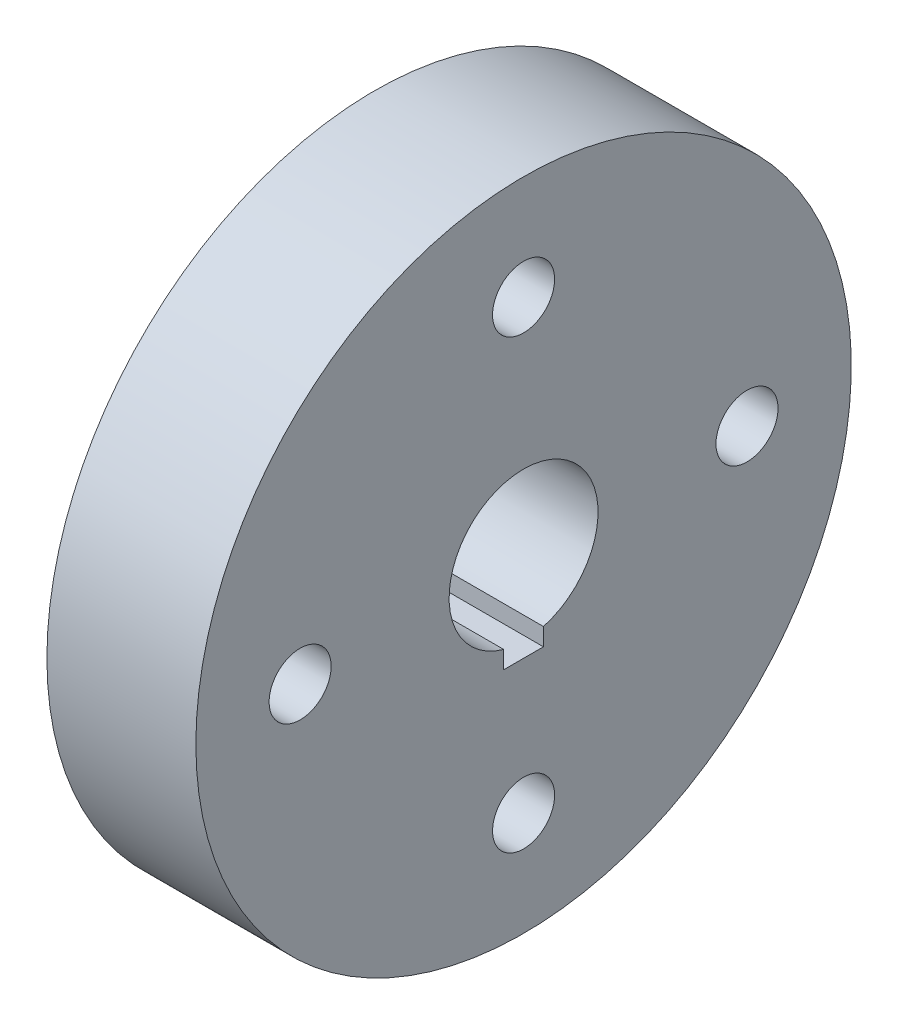
ISO-10303-21;
HEADER;
FILE_DESCRIPTION(('STEP AP214'),'2;1');
FILE_NAME('part.step','',(''),(''),'','','');
FILE_SCHEMA(('AUTOMOTIVE_DESIGN { 1 0 10303 214 1 1 1 1 }'));
ENDSEC;
DATA;
#1=APPLICATION_CONTEXT('core data for automotive mechanical design processes');
#2=APPLICATION_PROTOCOL_DEFINITION('international standard','automotive_design',2000,#1);
#3=PRODUCT_CONTEXT('',#1,'mechanical');
#4=PRODUCT('Part','Part','',(#3));
#5=PRODUCT_RELATED_PRODUCT_CATEGORY('part','',(#4));
#6=PRODUCT_DEFINITION_FORMATION('','',#4);
#7=PRODUCT_DEFINITION_CONTEXT('part definition',#1,'design');
#8=PRODUCT_DEFINITION('design','',#6,#7);
#9=PRODUCT_DEFINITION_SHAPE('','',#8);
#10=(LENGTH_UNIT() NAMED_UNIT(*) SI_UNIT(.MILLI.,.METRE.));
#11=(NAMED_UNIT(*) PLANE_ANGLE_UNIT() SI_UNIT($,.RADIAN.));
#12=(NAMED_UNIT(*) SI_UNIT($,.STERADIAN.) SOLID_ANGLE_UNIT());
#13=UNCERTAINTY_MEASURE_WITH_UNIT(LENGTH_MEASURE(1.E-05),#10,'distance_accuracy_value','');
#14=(GEOMETRIC_REPRESENTATION_CONTEXT(3) GLOBAL_UNCERTAINTY_ASSIGNED_CONTEXT((#13)) GLOBAL_UNIT_ASSIGNED_CONTEXT((#10,
#11,#12)) REPRESENTATION_CONTEXT('',''));
#15=CARTESIAN_POINT('',(0.,0.,0.));
#16=DIRECTION('',(0.,0.,1.));
#17=DIRECTION('',(1.,0.,0.));
#18=AXIS2_PLACEMENT_3D('',#15,#16,#17);
#19=CARTESIAN_POINT('',(502.152262189073,978.585270427388,20.));
#20=DIRECTION('',(1.,0.,0.));
#21=DIRECTION('',(0.,0.,1.));
#22=AXIS2_PLACEMENT_3D('',#19,#20,#21);
#23=CYLINDRICAL_SURFACE('',#22,27.5);
#24=CARTESIAN_POINT('',(462.152262189073,978.585270427388,20.));
#25=DIRECTION('',(-1.,0.,0.));
#26=DIRECTION('',(0.,0.,-1.));
#27=AXIS2_PLACEMENT_3D('',#24,#25,#26);
#28=CIRCLE('',#27,27.5);
#29=CARTESIAN_POINT('',(462.152262189073,978.585270427388,-7.5));
#30=VERTEX_POINT('',#29);
#31=EDGE_CURVE('E152',#30,#30,#28,.T.);
#32=ORIENTED_EDGE('',*,*,#31,.F.);
#33=EDGE_LOOP('',(#32));
#34=FACE_BOUND('',#33,.T.);
#35=CARTESIAN_POINT('',(487.152262189073,978.585270427388,20.));
#36=DIRECTION('',(-1.,0.,0.));
#37=DIRECTION('',(0.,0.,1.));
#38=AXIS2_PLACEMENT_3D('',#35,#36,#37);
#39=CIRCLE('',#38,27.5);
#40=CARTESIAN_POINT('',(487.152262189073,978.585270427388,47.5));
#41=VERTEX_POINT('',#40);
#42=EDGE_CURVE('E11',#41,#41,#39,.T.);
#43=ORIENTED_EDGE('',*,*,#42,.T.);
#44=EDGE_LOOP('',(#43));
#45=FACE_BOUND('',#44,.T.);
#46=ADVANCED_FACE('F42',(#34,#45),#23,.T.);
#47=CARTESIAN_POINT('',(502.152262189073,978.585270427388,20.));
#48=DIRECTION('',(1.,0.,0.));
#49=DIRECTION('',(0.,-0.963788819653398,-0.266666666666665));
#50=AXIS2_PLACEMENT_3D('',#47,#48,#49);
#51=CYLINDRICAL_SURFACE('',#50,15.);
#52=CARTESIAN_POINT('',(502.152262189073,978.585270427388,20.));
#53=DIRECTION('',(1.,0.,0.));
#54=DIRECTION('',(0.,-0.963788819653398,-0.266666666666665));
#55=AXIS2_PLACEMENT_3D('',#52,#53,#54);
#56=CIRCLE('',#55,15.);
#57=CARTESIAN_POINT('',(502.152262189073,964.128438132587,16.));
#58=VERTEX_POINT('',#57);
#59=CARTESIAN_POINT('',(502.152262189073,964.128438132587,24.));
#60=VERTEX_POINT('',#59);
#61=EDGE_CURVE('E149',#58,#60,#56,.T.);
#62=ORIENTED_EDGE('',*,*,#61,.T.);
#63=DIRECTION('',(-1.,0.,0.));
#64=VECTOR('',#63,1.);
#65=CARTESIAN_POINT('',(502.152262189073,964.128438132587,24.));
#66=LINE('',#65,#64);
#67=CARTESIAN_POINT('',(462.152262189073,964.128438132587,24.));
#68=VERTEX_POINT('',#67);
#69=EDGE_CURVE('E160',#60,#68,#66,.T.);
#70=ORIENTED_EDGE('',*,*,#69,.T.);
#71=CARTESIAN_POINT('',(462.152262189073,978.585270427388,20.));
#72=DIRECTION('',(1.,0.,0.));
#73=DIRECTION('',(0.,-0.963788819653398,-0.266666666666665));
#74=AXIS2_PLACEMENT_3D('',#71,#72,#73);
#75=CIRCLE('',#74,15.);
#76=CARTESIAN_POINT('',(462.152262189073,964.128438132587,16.));
#77=VERTEX_POINT('',#76);
#78=EDGE_CURVE('E88',#77,#68,#75,.T.);
#79=ORIENTED_EDGE('',*,*,#78,.F.);
#80=DIRECTION('',(-1.,0.,0.));
#81=VECTOR('',#80,1.);
#82=CARTESIAN_POINT('',(502.152262189073,964.128438132587,16.));
#83=LINE('',#82,#81);
#84=EDGE_CURVE('E172',#58,#77,#83,.T.);
#85=ORIENTED_EDGE('',*,*,#84,.F.);
#86=EDGE_LOOP('',(#62,#70,#79,#85));
#87=FACE_BOUND('',#86,.T.);
#88=ADVANCED_FACE('F201',(#87),#51,.F.);
#89=CARTESIAN_POINT('',(487.152262189073,978.585270427388,20.));
#90=DIRECTION('',(-1.,0.,0.));
#91=DIRECTION('',(0.,0.,-1.));
#92=AXIS2_PLACEMENT_3D('',#89,#90,#91);
#93=PLANE('',#92);
#94=CARTESIAN_POINT('',(487.152262189073,978.585270427388,20.));
#95=DIRECTION('',(-1.,0.,0.));
#96=DIRECTION('',(0.,0.,-1.));
#97=AXIS2_PLACEMENT_3D('',#94,#95,#96);
#98=CIRCLE('',#97,60.);
#99=CARTESIAN_POINT('',(487.152262189073,978.585270427388,-40.));
#100=VERTEX_POINT('',#99);
#101=EDGE_CURVE('E123',#100,#100,#98,.T.);
#102=ORIENTED_EDGE('',*,*,#101,.T.);
#103=EDGE_LOOP('',(#102));
#104=FACE_BOUND('',#103,.T.);
#105=CARTESIAN_POINT('',(487.152262189073,978.585270427388,-25.));
#106=DIRECTION('',(1.,0.,0.));
#107=DIRECTION('',(0.,0.,-1.));
#108=AXIS2_PLACEMENT_3D('',#105,#106,#107);
#109=CIRCLE('',#108,6.25);
#110=CARTESIAN_POINT('',(487.152262189073,978.585270427388,-18.75));
#111=VERTEX_POINT('',#110);
#112=EDGE_CURVE('E130',#111,#111,#109,.T.);
#113=ORIENTED_EDGE('',*,*,#112,.T.);
#114=EDGE_LOOP('',(#113));
#115=FACE_BOUND('',#114,.T.);
#116=CARTESIAN_POINT('',(487.152262189073,933.585270427388,20.));
#117=DIRECTION('',(1.,0.,0.));
#118=DIRECTION('',(0.,0.,1.));
#119=AXIS2_PLACEMENT_3D('',#116,#117,#118);
#120=CIRCLE('',#119,6.25);
#121=CARTESIAN_POINT('',(487.152262189073,933.585270427388,13.75));
#122=VERTEX_POINT('',#121);
#123=EDGE_CURVE('E143',#122,#122,#120,.T.);
#124=ORIENTED_EDGE('',*,*,#123,.T.);
#125=EDGE_LOOP('',(#124));
#126=FACE_BOUND('',#125,.T.);
#127=ORIENTED_EDGE('',*,*,#42,.F.);
#128=EDGE_LOOP('',(#127));
#129=FACE_BOUND('',#128,.T.);
#130=CARTESIAN_POINT('',(487.152262189073,978.585270427388,65.));
#131=DIRECTION('',(1.,0.,0.));
#132=DIRECTION('',(0.,0.,-1.));
#133=AXIS2_PLACEMENT_3D('',#130,#131,#132);
#134=CIRCLE('',#133,6.25);
#135=CARTESIAN_POINT('',(487.152262189073,978.585270427388,71.25));
#136=VERTEX_POINT('',#135);
#137=EDGE_CURVE('E139',#136,#136,#134,.T.);
#138=ORIENTED_EDGE('',*,*,#137,.T.);
#139=EDGE_LOOP('',(#138));
#140=FACE_BOUND('',#139,.T.);
#141=CARTESIAN_POINT('',(487.152262189073,1023.58527042739,20.));
#142=DIRECTION('',(1.,0.,0.));
#143=DIRECTION('',(0.,0.,-1.));
#144=AXIS2_PLACEMENT_3D('',#141,#142,#143);
#145=CIRCLE('',#144,6.25);
#146=CARTESIAN_POINT('',(487.152262189073,1023.58527042739,26.25));
#147=VERTEX_POINT('',#146);
#148=EDGE_CURVE('E52',#147,#147,#145,.T.);
#149=ORIENTED_EDGE('',*,*,#148,.T.);
#150=EDGE_LOOP('',(#149));
#151=FACE_BOUND('',#150,.T.);
#152=ADVANCED_FACE('F124',(#104,#115,#126,#129,#140,#151),#93,.T.);
#153=CARTESIAN_POINT('',(502.152262189073,1023.58527042739,20.));
#154=DIRECTION('',(1.,0.,0.));
#155=DIRECTION('',(0.,0.,-1.));
#156=AXIS2_PLACEMENT_3D('',#153,#154,#155);
#157=CYLINDRICAL_SURFACE('',#156,6.25);
#158=CARTESIAN_POINT('',(502.152262189073,1023.58527042739,20.));
#159=DIRECTION('',(1.,0.,0.));
#160=DIRECTION('',(0.,0.,-1.));
#161=AXIS2_PLACEMENT_3D('',#158,#159,#160);
#162=CIRCLE('',#161,6.25);
#163=CARTESIAN_POINT('',(502.152262189073,1023.58527042739,26.25));
#164=VERTEX_POINT('',#163);
#165=EDGE_CURVE('E132',#164,#164,#162,.T.);
#166=ORIENTED_EDGE('',*,*,#165,.T.);
#167=EDGE_LOOP('',(#166));
#168=FACE_BOUND('',#167,.T.);
#169=ORIENTED_EDGE('',*,*,#148,.F.);
#170=EDGE_LOOP('',(#169));
#171=FACE_BOUND('',#170,.T.);
#172=ADVANCED_FACE('F223',(#168,#171),#157,.F.);
#173=CARTESIAN_POINT('',(502.152262189073,978.585270427388,65.));
#174=DIRECTION('',(1.,0.,0.));
#175=DIRECTION('',(0.,0.,-1.));
#176=AXIS2_PLACEMENT_3D('',#173,#174,#175);
#177=CYLINDRICAL_SURFACE('',#176,6.25);
#178=CARTESIAN_POINT('',(502.152262189073,978.585270427388,65.));
#179=DIRECTION('',(1.,0.,0.));
#180=DIRECTION('',(0.,0.,-1.));
#181=AXIS2_PLACEMENT_3D('',#178,#179,#180);
#182=CIRCLE('',#181,6.25);
#183=CARTESIAN_POINT('',(502.152262189073,978.585270427388,71.25));
#184=VERTEX_POINT('',#183);
#185=EDGE_CURVE('E165',#184,#184,#182,.T.);
#186=ORIENTED_EDGE('',*,*,#185,.T.);
#187=EDGE_LOOP('',(#186));
#188=FACE_BOUND('',#187,.T.);
#189=ORIENTED_EDGE('',*,*,#137,.F.);
#190=EDGE_LOOP('',(#189));
#191=FACE_BOUND('',#190,.T.);
#192=ADVANCED_FACE('F226',(#188,#191),#177,.F.);
#193=CARTESIAN_POINT('',(502.152262189073,933.585270427388,20.));
#194=DIRECTION('',(1.,0.,0.));
#195=DIRECTION('',(0.,0.,1.));
#196=AXIS2_PLACEMENT_3D('',#193,#194,#195);
#197=CYLINDRICAL_SURFACE('',#196,6.25);
#198=CARTESIAN_POINT('',(502.152262189073,933.585270427388,20.));
#199=DIRECTION('',(1.,0.,0.));
#200=DIRECTION('',(0.,0.,1.));
#201=AXIS2_PLACEMENT_3D('',#198,#199,#200);
#202=CIRCLE('',#201,6.25);
#203=CARTESIAN_POINT('',(502.152262189073,933.585270427388,13.75));
#204=VERTEX_POINT('',#203);
#205=EDGE_CURVE('E46',#204,#204,#202,.T.);
#206=ORIENTED_EDGE('',*,*,#205,.T.);
#207=EDGE_LOOP('',(#206));
#208=FACE_BOUND('',#207,.T.);
#209=ORIENTED_EDGE('',*,*,#123,.F.);
#210=EDGE_LOOP('',(#209));
#211=FACE_BOUND('',#210,.T.);
#212=ADVANCED_FACE('F234',(#208,#211),#197,.F.);
#213=CARTESIAN_POINT('',(502.152262189073,978.585270427388,-25.));
#214=DIRECTION('',(1.,0.,0.));
#215=DIRECTION('',(0.,0.,-1.));
#216=AXIS2_PLACEMENT_3D('',#213,#214,#215);
#217=CYLINDRICAL_SURFACE('',#216,6.25);
#218=CARTESIAN_POINT('',(502.152262189073,978.585270427388,-25.));
#219=DIRECTION('',(1.,0.,0.));
#220=DIRECTION('',(0.,0.,-1.));
#221=AXIS2_PLACEMENT_3D('',#218,#219,#220);
#222=CIRCLE('',#221,6.25);
#223=CARTESIAN_POINT('',(502.152262189073,978.585270427388,-18.75));
#224=VERTEX_POINT('',#223);
#225=EDGE_CURVE('E140',#224,#224,#222,.T.);
#226=ORIENTED_EDGE('',*,*,#225,.T.);
#227=EDGE_LOOP('',(#226));
#228=FACE_BOUND('',#227,.T.);
#229=ORIENTED_EDGE('',*,*,#112,.F.);
#230=EDGE_LOOP('',(#229));
#231=FACE_BOUND('',#230,.T.);
#232=ADVANCED_FACE('F232',(#228,#231),#217,.F.);
#233=CARTESIAN_POINT('',(472.152262189073,978.585270427388,20.));
#234=DIRECTION('',(-1.,0.,0.));
#235=DIRECTION('',(0.,0.,-1.));
#236=AXIS2_PLACEMENT_3D('',#233,#234,#235);
#237=PLANE('',#236);
#238=CARTESIAN_POINT('',(472.152262189073,978.585270427388,20.));
#239=DIRECTION('',(-1.,0.,0.));
#240=DIRECTION('',(0.,0.,1.));
#241=AXIS2_PLACEMENT_3D('',#238,#239,#240);
#242=CIRCLE('',#241,66.);
#243=CARTESIAN_POINT('',(472.152262189073,978.585270427388,86.));
#244=VERTEX_POINT('',#243);
#245=EDGE_CURVE('E127',#244,#244,#242,.T.);
#246=ORIENTED_EDGE('',*,*,#245,.T.);
#247=EDGE_LOOP('',(#246));
#248=FACE_BOUND('',#247,.T.);
#249=CARTESIAN_POINT('',(472.152262189073,978.585270427388,20.));
#250=DIRECTION('',(1.,0.,0.));
#251=DIRECTION('',(0.,0.,1.));
#252=AXIS2_PLACEMENT_3D('',#249,#250,#251);
#253=CIRCLE('',#252,60.);
#254=CARTESIAN_POINT('',(472.152262189073,978.585270427388,-40.));
#255=VERTEX_POINT('',#254);
#256=EDGE_CURVE('E128',#255,#255,#253,.T.);
#257=ORIENTED_EDGE('',*,*,#256,.T.);
#258=EDGE_LOOP('',(#257));
#259=FACE_BOUND('',#258,.T.);
#260=ADVANCED_FACE('F222',(#248,#259),#237,.T.);
#261=CARTESIAN_POINT('',(502.152262189073,978.585270427388,20.));
#262=DIRECTION('',(1.,0.,0.));
#263=DIRECTION('',(0.,0.,-1.));
#264=AXIS2_PLACEMENT_3D('',#261,#262,#263);
#265=CYLINDRICAL_SURFACE('',#264,66.);
#266=CARTESIAN_POINT('',(502.152262189073,978.585270427388,20.));
#267=DIRECTION('',(-1.,0.,0.));
#268=DIRECTION('',(0.,0.,-1.));
#269=AXIS2_PLACEMENT_3D('',#266,#267,#268);
#270=CIRCLE('',#269,66.);
#271=CARTESIAN_POINT('',(502.152262189073,978.585270427388,86.));
#272=VERTEX_POINT('',#271);
#273=EDGE_CURVE('E142',#272,#272,#270,.T.);
#274=ORIENTED_EDGE('',*,*,#273,.T.);
#275=EDGE_LOOP('',(#274));
#276=FACE_BOUND('',#275,.T.);
#277=ORIENTED_EDGE('',*,*,#245,.F.);
#278=EDGE_LOOP('',(#277));
#279=FACE_BOUND('',#278,.T.);
#280=ADVANCED_FACE('F184',(#276,#279),#265,.T.);
#281=CARTESIAN_POINT('',(502.152262189073,978.585270427388,20.));
#282=DIRECTION('',(1.,0.,0.));
#283=DIRECTION('',(0.,0.,1.));
#284=AXIS2_PLACEMENT_3D('',#281,#282,#283);
#285=CYLINDRICAL_SURFACE('',#284,60.);
#286=ORIENTED_EDGE('',*,*,#101,.F.);
#287=EDGE_LOOP('',(#286));
#288=FACE_BOUND('',#287,.T.);
#289=ORIENTED_EDGE('',*,*,#256,.F.);
#290=EDGE_LOOP('',(#289));
#291=FACE_BOUND('',#290,.T.);
#292=ADVANCED_FACE('F191',(#288,#291),#285,.F.);
#293=CARTESIAN_POINT('',(502.152262189073,978.585270427388,20.));
#294=DIRECTION('',(-1.,0.,0.));
#295=DIRECTION('',(0.,0.,-1.));
#296=AXIS2_PLACEMENT_3D('',#293,#294,#295);
#297=PLANE('',#296);
#298=ORIENTED_EDGE('',*,*,#165,.F.);
#299=EDGE_LOOP('',(#298));
#300=FACE_BOUND('',#299,.T.);
#301=ORIENTED_EDGE('',*,*,#185,.F.);
#302=EDGE_LOOP('',(#301));
#303=FACE_BOUND('',#302,.T.);
#304=ORIENTED_EDGE('',*,*,#205,.F.);
#305=EDGE_LOOP('',(#304));
#306=FACE_BOUND('',#305,.T.);
#307=ORIENTED_EDGE('',*,*,#225,.F.);
#308=EDGE_LOOP('',(#307));
#309=FACE_BOUND('',#308,.T.);
#310=ORIENTED_EDGE('',*,*,#273,.F.);
#311=EDGE_LOOP('',(#310));
#312=FACE_BOUND('',#311,.T.);
#313=DIRECTION('',(0.,1.,0.));
#314=VECTOR('',#313,1.);
#315=CARTESIAN_POINT('',(502.152262189073,971.275570419888,23.9999999999997));
#316=LINE('',#315,#314);
#317=CARTESIAN_POINT('',(502.152262189073,960.585270427388,23.9999999999998));
#318=VERTEX_POINT('',#317);
#319=EDGE_CURVE('E145',#318,#60,#316,.T.);
#320=ORIENTED_EDGE('',*,*,#319,.T.);
#321=ORIENTED_EDGE('',*,*,#61,.F.);
#322=DIRECTION('',(0.,-1.,0.));
#323=VECTOR('',#322,1.);
#324=CARTESIAN_POINT('',(502.152262189073,971.275570419888,15.9999999999997));
#325=LINE('',#324,#323);
#326=CARTESIAN_POINT('',(502.152262189073,960.585270427388,15.9999999999998));
#327=VERTEX_POINT('',#326);
#328=EDGE_CURVE('E99',#58,#327,#325,.T.);
#329=ORIENTED_EDGE('',*,*,#328,.T.);
#330=DIRECTION('',(0.,0.,1.));
#331=VECTOR('',#330,1.);
#332=CARTESIAN_POINT('',(502.152262189073,960.585270427388,21.9999999999998));
#333=LINE('',#332,#331);
#334=EDGE_CURVE('E154',#327,#318,#333,.T.);
#335=ORIENTED_EDGE('',*,*,#334,.T.);
#336=EDGE_LOOP('',(#320,#321,#329,#335));
#337=FACE_BOUND('',#336,.T.);
#338=ADVANCED_FACE('F188',(#300,#303,#306,#309,#312,#337),#297,.F.);
#339=CARTESIAN_POINT('',(462.152262189073,978.585270427388,20.));
#340=DIRECTION('',(-1.,0.,0.));
#341=DIRECTION('',(0.,0.,-1.));
#342=AXIS2_PLACEMENT_3D('',#339,#340,#341);
#343=PLANE('',#342);
#344=ORIENTED_EDGE('',*,*,#31,.T.);
#345=EDGE_LOOP('',(#344));
#346=FACE_BOUND('',#345,.T.);
#347=DIRECTION('',(0.,-1.,0.));
#348=VECTOR('',#347,1.);
#349=CARTESIAN_POINT('',(462.152262189073,971.275570419888,23.9999999999998));
#350=LINE('',#349,#348);
#351=CARTESIAN_POINT('',(462.152262189073,960.585270427388,23.9999999999998));
#352=VERTEX_POINT('',#351);
#353=EDGE_CURVE('E136',#68,#352,#350,.T.);
#354=ORIENTED_EDGE('',*,*,#353,.T.);
#355=DIRECTION('',(0.,0.,-1.));
#356=VECTOR('',#355,1.);
#357=CARTESIAN_POINT('',(462.152262189073,960.585270427388,21.9999999999998));
#358=LINE('',#357,#356);
#359=CARTESIAN_POINT('',(462.152262189073,960.585270427388,15.9999999999998));
#360=VERTEX_POINT('',#359);
#361=EDGE_CURVE('E157',#352,#360,#358,.T.);
#362=ORIENTED_EDGE('',*,*,#361,.T.);
#363=DIRECTION('',(0.,1.,0.));
#364=VECTOR('',#363,1.);
#365=CARTESIAN_POINT('',(462.152262189073,971.275570419888,15.9999999999998));
#366=LINE('',#365,#364);
#367=EDGE_CURVE('E164',#360,#77,#366,.T.);
#368=ORIENTED_EDGE('',*,*,#367,.T.);
#369=ORIENTED_EDGE('',*,*,#78,.T.);
#370=EDGE_LOOP('',(#354,#362,#368,#369));
#371=FACE_BOUND('',#370,.T.);
#372=ADVANCED_FACE('F190',(#346,#371),#343,.T.);
#373=CARTESIAN_POINT('',(478.257446151498,963.965870412389,15.9999999999998));
#374=DIRECTION('',(0.,0.,-1.));
#375=DIRECTION('',(-1.,0.,0.));
#376=AXIS2_PLACEMENT_3D('',#373,#374,#375);
#377=PLANE('',#376);
#378=ORIENTED_EDGE('',*,*,#367,.F.);
#379=DIRECTION('',(-1.,0.,0.));
#380=VECTOR('',#379,1.);
#381=CARTESIAN_POINT('',(502.152262189073,960.585270427388,15.9999999999998));
#382=LINE('',#381,#380);
#383=EDGE_CURVE('E156',#327,#360,#382,.T.);
#384=ORIENTED_EDGE('',*,*,#383,.F.);
#385=ORIENTED_EDGE('',*,*,#328,.F.);
#386=ORIENTED_EDGE('',*,*,#84,.T.);
#387=EDGE_LOOP('',(#378,#384,#385,#386));
#388=FACE_BOUND('',#387,.T.);
#389=ADVANCED_FACE('F202',(#388),#377,.F.);
#390=CARTESIAN_POINT('',(502.152262189073,960.585270427388,23.9999999999998));
#391=DIRECTION('',(0.,-1.,0.));
#392=DIRECTION('',(-1.,0.,0.));
#393=AXIS2_PLACEMENT_3D('',#390,#391,#392);
#394=PLANE('',#393);
#395=ORIENTED_EDGE('',*,*,#361,.F.);
#396=DIRECTION('',(-1.,0.,0.));
#397=VECTOR('',#396,1.);
#398=CARTESIAN_POINT('',(502.152262189073,960.585270427388,23.9999999999998));
#399=LINE('',#398,#397);
#400=EDGE_CURVE('E148',#318,#352,#399,.T.);
#401=ORIENTED_EDGE('',*,*,#400,.F.);
#402=ORIENTED_EDGE('',*,*,#334,.F.);
#403=ORIENTED_EDGE('',*,*,#383,.T.);
#404=EDGE_LOOP('',(#395,#401,#402,#403));
#405=FACE_BOUND('',#404,.T.);
#406=ADVANCED_FACE('F44',(#405),#394,.F.);
#407=CARTESIAN_POINT('',(478.257446151498,963.965870412389,23.9999999999998));
#408=DIRECTION('',(0.,0.,-1.));
#409=DIRECTION('',(-1.,0.,0.));
#410=AXIS2_PLACEMENT_3D('',#407,#408,#409);
#411=PLANE('',#410);
#412=ORIENTED_EDGE('',*,*,#319,.F.);
#413=ORIENTED_EDGE('',*,*,#400,.T.);
#414=ORIENTED_EDGE('',*,*,#353,.F.);
#415=ORIENTED_EDGE('',*,*,#69,.F.);
#416=EDGE_LOOP('',(#412,#413,#414,#415));
#417=FACE_BOUND('',#416,.T.);
#418=ADVANCED_FACE('F199',(#417),#411,.T.);
#419=CLOSED_SHELL('',(#46,#88,#152,#172,#192,#212,#232,#260,#280,#292,#338,#372,#389,#406,#418));
#420=MANIFOLD_SOLID_BREP('B2',#419);
#421=ADVANCED_BREP_SHAPE_REPRESENTATION('',(#18,#420),#14);
#422=SHAPE_DEFINITION_REPRESENTATION(#9,#421);
ENDSEC;
END-ISO-10303-21;
